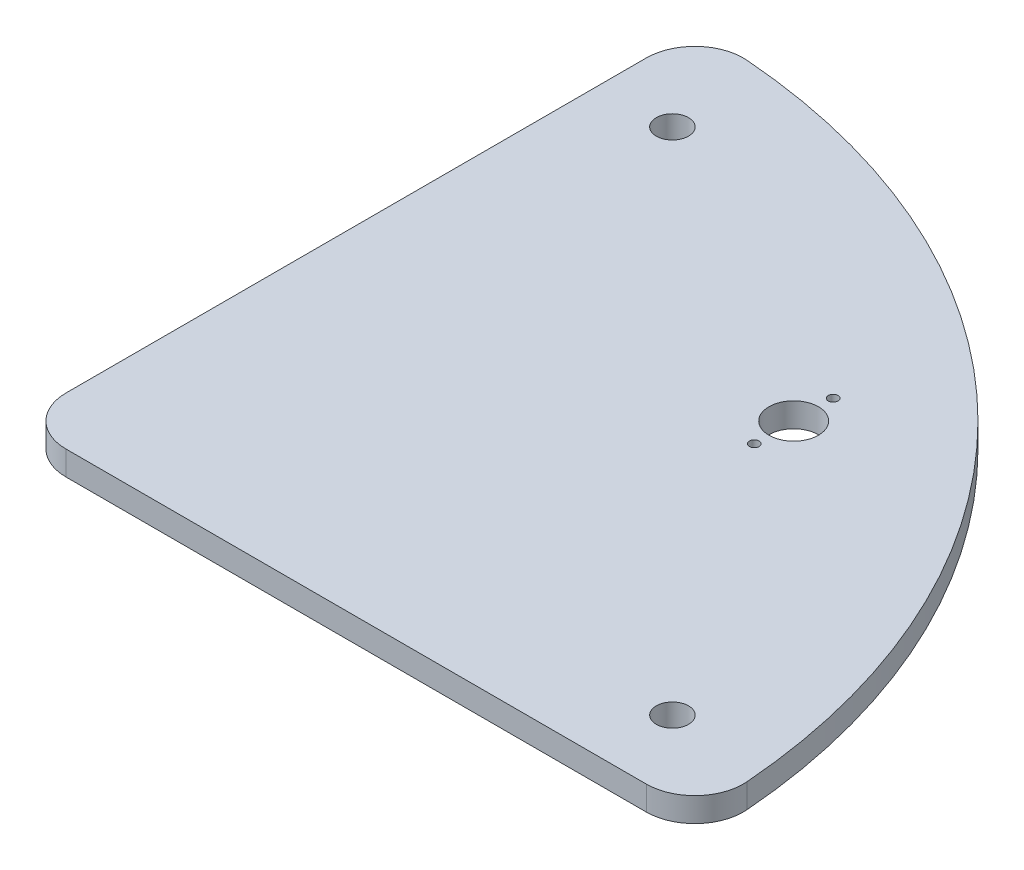
ISO-10303-21;
HEADER;
FILE_DESCRIPTION(('STEP AP214'),'2;1');
FILE_NAME('part.step','',(''),(''),'','','');
FILE_SCHEMA(('AUTOMOTIVE_DESIGN { 1 0 10303 214 1 1 1 1 }'));
ENDSEC;
DATA;
#1=APPLICATION_CONTEXT('core data for automotive mechanical design processes');
#2=APPLICATION_PROTOCOL_DEFINITION('international standard','automotive_design',2000,#1);
#3=PRODUCT_CONTEXT('',#1,'mechanical');
#4=PRODUCT('Part','Part','',(#3));
#5=PRODUCT_RELATED_PRODUCT_CATEGORY('part','',(#4));
#6=PRODUCT_DEFINITION_FORMATION('','',#4);
#7=PRODUCT_DEFINITION_CONTEXT('part definition',#1,'design');
#8=PRODUCT_DEFINITION('design','',#6,#7);
#9=PRODUCT_DEFINITION_SHAPE('','',#8);
#10=(LENGTH_UNIT() NAMED_UNIT(*) SI_UNIT(.MILLI.,.METRE.));
#11=(NAMED_UNIT(*) PLANE_ANGLE_UNIT() SI_UNIT($,.RADIAN.));
#12=(NAMED_UNIT(*) SI_UNIT($,.STERADIAN.) SOLID_ANGLE_UNIT());
#13=UNCERTAINTY_MEASURE_WITH_UNIT(LENGTH_MEASURE(1.E-05),#10,'distance_accuracy_value','');
#14=(GEOMETRIC_REPRESENTATION_CONTEXT(3) GLOBAL_UNCERTAINTY_ASSIGNED_CONTEXT((#13)) GLOBAL_UNIT_ASSIGNED_CONTEXT((#10,
#11,#12)) REPRESENTATION_CONTEXT('',''));
#15=CARTESIAN_POINT('',(0.,0.,0.));
#16=DIRECTION('',(0.,0.,1.));
#17=DIRECTION('',(1.,0.,0.));
#18=AXIS2_PLACEMENT_3D('',#15,#16,#17);
#19=CARTESIAN_POINT('',(0.,3.175,0.));
#20=DIRECTION('',(0.,0.,-1.));
#21=DIRECTION('',(-1.,0.,0.));
#22=AXIS2_PLACEMENT_3D('',#19,#20,#21);
#23=PLANE('',#22);
#24=DIRECTION('',(1.,0.,0.));
#25=VECTOR('',#24,1.);
#26=CARTESIAN_POINT('',(0.,-3.175,0.));
#27=LINE('',#26,#25);
#28=CARTESIAN_POINT('',(12.7,-3.175,0.));
#29=VERTEX_POINT('',#28);
#30=CARTESIAN_POINT('',(164.61081373956,-3.175,0.));
#31=VERTEX_POINT('',#30);
#32=EDGE_CURVE('E112',#29,#31,#27,.T.);
#33=ORIENTED_EDGE('',*,*,#32,.T.);
#34=DIRECTION('',(0.,-1.,0.));
#35=VECTOR('',#34,1.);
#36=CARTESIAN_POINT('',(164.61081373956,3.175,0.));
#37=LINE('',#36,#35);
#38=CARTESIAN_POINT('',(164.61081373956,3.175,0.));
#39=VERTEX_POINT('',#38);
#40=EDGE_CURVE('E91',#31,#39,#37,.F.);
#41=ORIENTED_EDGE('',*,*,#40,.T.);
#42=DIRECTION('',(1.,0.,0.));
#43=VECTOR('',#42,1.);
#44=CARTESIAN_POINT('',(0.,3.175,0.));
#45=LINE('',#44,#43);
#46=CARTESIAN_POINT('',(12.7,3.175,0.));
#47=VERTEX_POINT('',#46);
#48=EDGE_CURVE('E114',#47,#39,#45,.T.);
#49=ORIENTED_EDGE('',*,*,#48,.F.);
#50=DIRECTION('',(0.,-1.,0.));
#51=VECTOR('',#50,1.);
#52=CARTESIAN_POINT('',(12.7,3.175,0.));
#53=LINE('',#52,#51);
#54=EDGE_CURVE('E96',#47,#29,#53,.T.);
#55=ORIENTED_EDGE('',*,*,#54,.T.);
#56=EDGE_LOOP('',(#33,#41,#49,#55));
#57=FACE_BOUND('',#56,.T.);
#58=ADVANCED_FACE('F33',(#57),#23,.F.);
#59=CARTESIAN_POINT('',(0.,3.175,0.));
#60=DIRECTION('',(0.,-1.,0.));
#61=DIRECTION('',(0.,0.,-1.));
#62=AXIS2_PLACEMENT_3D('',#59,#60,#61);
#63=CYLINDRICAL_SURFACE('',#62,177.8);
#64=CARTESIAN_POINT('',(0.,3.175,0.));
#65=DIRECTION('',(0.,1.,0.));
#66=DIRECTION('',(0.,0.,-1.));
#67=AXIS2_PLACEMENT_3D('',#64,#65,#66);
#68=CIRCLE('',#67,177.8);
#69=CARTESIAN_POINT('',(177.273184027218,3.175,-13.6769230769231));
#70=VERTEX_POINT('',#69);
#71=CARTESIAN_POINT('',(13.6769230769231,3.175,-177.273184027218));
#72=VERTEX_POINT('',#71);
#73=EDGE_CURVE('E105',#70,#72,#68,.T.);
#74=ORIENTED_EDGE('',*,*,#73,.F.);
#75=DIRECTION('',(0.,-1.,0.));
#76=VECTOR('',#75,1.);
#77=CARTESIAN_POINT('',(177.273184027218,3.175,-13.6769230769231));
#78=LINE('',#77,#76);
#79=CARTESIAN_POINT('',(177.273184027218,-3.175,-13.6769230769231));
#80=VERTEX_POINT('',#79);
#81=EDGE_CURVE('E90',#70,#80,#78,.T.);
#82=ORIENTED_EDGE('',*,*,#81,.T.);
#83=CARTESIAN_POINT('',(0.,-3.175,0.));
#84=DIRECTION('',(0.,1.,0.));
#85=DIRECTION('',(0.,0.,-1.));
#86=AXIS2_PLACEMENT_3D('',#83,#84,#85);
#87=CIRCLE('',#86,177.8);
#88=CARTESIAN_POINT('',(13.6769230769231,-3.175,-177.273184027218));
#89=VERTEX_POINT('',#88);
#90=EDGE_CURVE('E103',#80,#89,#87,.T.);
#91=ORIENTED_EDGE('',*,*,#90,.T.);
#92=DIRECTION('',(0.,-1.,0.));
#93=VECTOR('',#92,1.);
#94=CARTESIAN_POINT('',(13.6769230769231,3.175,-177.273184027218));
#95=LINE('',#94,#93);
#96=EDGE_CURVE('E107',#89,#72,#95,.F.);
#97=ORIENTED_EDGE('',*,*,#96,.T.);
#98=EDGE_LOOP('',(#74,#82,#91,#97));
#99=FACE_BOUND('',#98,.T.);
#100=ADVANCED_FACE('F102',(#99),#63,.T.);
#101=CARTESIAN_POINT('',(0.,3.175,-177.8));
#102=DIRECTION('',(1.,0.,0.));
#103=DIRECTION('',(0.,0.,-1.));
#104=AXIS2_PLACEMENT_3D('',#101,#102,#103);
#105=PLANE('',#104);
#106=DIRECTION('',(0.,0.,1.));
#107=VECTOR('',#106,1.);
#108=CARTESIAN_POINT('',(0.,-3.175,-177.8));
#109=LINE('',#108,#107);
#110=CARTESIAN_POINT('',(0.,-3.175,-164.61081373956));
#111=VERTEX_POINT('',#110);
#112=CARTESIAN_POINT('',(0.,-3.175,-12.7));
#113=VERTEX_POINT('',#112);
#114=EDGE_CURVE('E111',#111,#113,#109,.T.);
#115=ORIENTED_EDGE('',*,*,#114,.T.);
#116=DIRECTION('',(0.,-1.,0.));
#117=VECTOR('',#116,1.);
#118=CARTESIAN_POINT('',(0.,3.175,-12.7));
#119=LINE('',#118,#117);
#120=CARTESIAN_POINT('',(0.,3.175,-12.7));
#121=VERTEX_POINT('',#120);
#122=EDGE_CURVE('E11',#113,#121,#119,.F.);
#123=ORIENTED_EDGE('',*,*,#122,.T.);
#124=DIRECTION('',(0.,0.,1.));
#125=VECTOR('',#124,1.);
#126=CARTESIAN_POINT('',(0.,3.175,-177.8));
#127=LINE('',#126,#125);
#128=CARTESIAN_POINT('',(0.,3.175,-164.61081373956));
#129=VERTEX_POINT('',#128);
#130=EDGE_CURVE('E120',#129,#121,#127,.T.);
#131=ORIENTED_EDGE('',*,*,#130,.F.);
#132=DIRECTION('',(0.,-1.,0.));
#133=VECTOR('',#132,1.);
#134=CARTESIAN_POINT('',(0.,3.175,-164.61081373956));
#135=LINE('',#134,#133);
#136=EDGE_CURVE('E41',#129,#111,#135,.T.);
#137=ORIENTED_EDGE('',*,*,#136,.T.);
#138=EDGE_LOOP('',(#115,#123,#131,#137));
#139=FACE_BOUND('',#138,.T.);
#140=ADVANCED_FACE('F133',(#139),#105,.F.);
#141=CARTESIAN_POINT('',(0.,3.175,0.));
#142=DIRECTION('',(0.,-1.,0.));
#143=DIRECTION('',(0.,0.,-1.));
#144=AXIS2_PLACEMENT_3D('',#141,#142,#143);
#145=PLANE('',#144);
#146=CARTESIAN_POINT('',(19.05,3.175,-152.4));
#147=DIRECTION('',(0.,1.,0.));
#148=DIRECTION('',(0.,0.,1.));
#149=AXIS2_PLACEMENT_3D('',#146,#147,#148);
#150=CIRCLE('',#149,4.21639999999999);
#151=CARTESIAN_POINT('',(19.05,3.175,-148.1836));
#152=VERTEX_POINT('',#151);
#153=EDGE_CURVE('E298',#152,#152,#150,.T.);
#154=ORIENTED_EDGE('',*,*,#153,.F.);
#155=EDGE_LOOP('',(#154));
#156=FACE_BOUND('',#155,.T.);
#157=CARTESIAN_POINT('',(152.4,3.175,-19.05));
#158=DIRECTION('',(0.,1.,0.));
#159=DIRECTION('',(0.,0.,1.));
#160=AXIS2_PLACEMENT_3D('',#157,#158,#159);
#161=CIRCLE('',#160,4.21639999999998);
#162=CARTESIAN_POINT('',(152.4,3.175,-14.8336000000001));
#163=VERTEX_POINT('',#162);
#164=EDGE_CURVE('E290',#163,#163,#161,.T.);
#165=ORIENTED_EDGE('',*,*,#164,.F.);
#166=EDGE_LOOP('',(#165));
#167=FACE_BOUND('',#166,.T.);
#168=CARTESIAN_POINT('',(101.6,3.175,-91.2749));
#169=DIRECTION('',(0.,1.,0.));
#170=DIRECTION('',(0.,0.,1.));
#171=AXIS2_PLACEMENT_3D('',#168,#169,#170);
#172=CIRCLE('',#171,1.26999999999999);
#173=CARTESIAN_POINT('',(101.6,3.175,-90.0049));
#174=VERTEX_POINT('',#173);
#175=EDGE_CURVE('E272',#174,#174,#172,.T.);
#176=ORIENTED_EDGE('',*,*,#175,.F.);
#177=EDGE_LOOP('',(#176));
#178=FACE_BOUND('',#177,.T.);
#179=CARTESIAN_POINT('',(101.6,3.175,-111.9251));
#180=DIRECTION('',(0.,1.,0.));
#181=DIRECTION('',(0.,0.,1.));
#182=AXIS2_PLACEMENT_3D('',#179,#180,#181);
#183=CIRCLE('',#182,1.26999999999999);
#184=CARTESIAN_POINT('',(101.6,3.175,-110.6551));
#185=VERTEX_POINT('',#184);
#186=EDGE_CURVE('E285',#185,#185,#183,.T.);
#187=ORIENTED_EDGE('',*,*,#186,.F.);
#188=EDGE_LOOP('',(#187));
#189=FACE_BOUND('',#188,.T.);
#190=CARTESIAN_POINT('',(101.6,3.175,-101.6));
#191=DIRECTION('',(0.,1.,0.));
#192=DIRECTION('',(0.,0.,1.));
#193=AXIS2_PLACEMENT_3D('',#190,#191,#192);
#194=CIRCLE('',#193,6.477);
#195=CARTESIAN_POINT('',(101.6,3.175,-95.123));
#196=VERTEX_POINT('',#195);
#197=EDGE_CURVE('E145',#196,#196,#194,.T.);
#198=ORIENTED_EDGE('',*,*,#197,.F.);
#199=EDGE_LOOP('',(#198));
#200=FACE_BOUND('',#199,.T.);
#201=ORIENTED_EDGE('',*,*,#48,.T.);
#202=CARTESIAN_POINT('',(164.61081373956,3.175,-12.7));
#203=DIRECTION('',(0.,-1.,0.));
#204=DIRECTION('',(0.,0.,-1.));
#205=AXIS2_PLACEMENT_3D('',#202,#203,#204);
#206=CIRCLE('',#205,12.7);
#207=EDGE_CURVE('E130',#39,#70,#206,.F.);
#208=ORIENTED_EDGE('',*,*,#207,.T.);
#209=ORIENTED_EDGE('',*,*,#73,.T.);
#210=CARTESIAN_POINT('',(12.7,3.175,-164.61081373956));
#211=DIRECTION('',(0.,-1.,0.));
#212=DIRECTION('',(0.,0.,-1.));
#213=AXIS2_PLACEMENT_3D('',#210,#211,#212);
#214=CIRCLE('',#213,12.7);
#215=EDGE_CURVE('E53',#72,#129,#214,.F.);
#216=ORIENTED_EDGE('',*,*,#215,.T.);
#217=ORIENTED_EDGE('',*,*,#130,.T.);
#218=CARTESIAN_POINT('',(12.7,3.175,-12.7));
#219=DIRECTION('',(0.,-1.,0.));
#220=DIRECTION('',(0.,0.,-1.));
#221=AXIS2_PLACEMENT_3D('',#218,#219,#220);
#222=CIRCLE('',#221,12.7);
#223=EDGE_CURVE('E128',#121,#47,#222,.F.);
#224=ORIENTED_EDGE('',*,*,#223,.T.);
#225=EDGE_LOOP('',(#201,#208,#209,#216,#217,#224));
#226=FACE_BOUND('',#225,.T.);
#227=ADVANCED_FACE('F147',(#156,#167,#178,#189,#200,#226),#145,.F.);
#228=CARTESIAN_POINT('',(0.,-3.175,0.));
#229=DIRECTION('',(0.,-1.,0.));
#230=DIRECTION('',(0.,0.,-1.));
#231=AXIS2_PLACEMENT_3D('',#228,#229,#230);
#232=PLANE('',#231);
#233=CARTESIAN_POINT('',(19.05,-3.17499999999999,-152.4));
#234=DIRECTION('',(0.,1.,0.));
#235=DIRECTION('',(0.,0.,1.));
#236=AXIS2_PLACEMENT_3D('',#233,#234,#235);
#237=CIRCLE('',#236,4.21639999999999);
#238=CARTESIAN_POINT('',(19.05,-3.17499999999999,-148.1836));
#239=VERTEX_POINT('',#238);
#240=EDGE_CURVE('E294',#239,#239,#237,.T.);
#241=ORIENTED_EDGE('',*,*,#240,.T.);
#242=EDGE_LOOP('',(#241));
#243=FACE_BOUND('',#242,.T.);
#244=CARTESIAN_POINT('',(152.4,-3.17499999999999,-19.05));
#245=DIRECTION('',(0.,1.,0.));
#246=DIRECTION('',(0.,0.,1.));
#247=AXIS2_PLACEMENT_3D('',#244,#245,#246);
#248=CIRCLE('',#247,4.21639999999998);
#249=CARTESIAN_POINT('',(152.4,-3.17499999999999,-14.8336000000001));
#250=VERTEX_POINT('',#249);
#251=EDGE_CURVE('E280',#250,#250,#248,.T.);
#252=ORIENTED_EDGE('',*,*,#251,.T.);
#253=EDGE_LOOP('',(#252));
#254=FACE_BOUND('',#253,.T.);
#255=CARTESIAN_POINT('',(101.6,-3.175,-91.2749));
#256=DIRECTION('',(0.,1.,0.));
#257=DIRECTION('',(0.,0.,1.));
#258=AXIS2_PLACEMENT_3D('',#255,#256,#257);
#259=CIRCLE('',#258,1.26999999999999);
#260=CARTESIAN_POINT('',(101.6,-3.175,-90.0049));
#261=VERTEX_POINT('',#260);
#262=EDGE_CURVE('E270',#261,#261,#259,.T.);
#263=ORIENTED_EDGE('',*,*,#262,.T.);
#264=EDGE_LOOP('',(#263));
#265=FACE_BOUND('',#264,.T.);
#266=CARTESIAN_POINT('',(101.6,-3.175,-111.9251));
#267=DIRECTION('',(0.,1.,0.));
#268=DIRECTION('',(0.,0.,1.));
#269=AXIS2_PLACEMENT_3D('',#266,#267,#268);
#270=CIRCLE('',#269,1.26999999999999);
#271=CARTESIAN_POINT('',(101.6,-3.175,-110.6551));
#272=VERTEX_POINT('',#271);
#273=EDGE_CURVE('E277',#272,#272,#270,.T.);
#274=ORIENTED_EDGE('',*,*,#273,.T.);
#275=EDGE_LOOP('',(#274));
#276=FACE_BOUND('',#275,.T.);
#277=CARTESIAN_POINT('',(101.6,-3.175,-101.6));
#278=DIRECTION('',(0.,1.,0.));
#279=DIRECTION('',(0.,0.,1.));
#280=AXIS2_PLACEMENT_3D('',#277,#278,#279);
#281=CIRCLE('',#280,6.477);
#282=CARTESIAN_POINT('',(101.6,-3.175,-95.123));
#283=VERTEX_POINT('',#282);
#284=EDGE_CURVE('E116',#283,#283,#281,.T.);
#285=ORIENTED_EDGE('',*,*,#284,.T.);
#286=EDGE_LOOP('',(#285));
#287=FACE_BOUND('',#286,.T.);
#288=ORIENTED_EDGE('',*,*,#90,.F.);
#289=CARTESIAN_POINT('',(164.61081373956,-3.175,-12.7));
#290=DIRECTION('',(0.,-1.,0.));
#291=DIRECTION('',(0.,0.,-1.));
#292=AXIS2_PLACEMENT_3D('',#289,#290,#291);
#293=CIRCLE('',#292,12.7);
#294=EDGE_CURVE('E86',#80,#31,#293,.T.);
#295=ORIENTED_EDGE('',*,*,#294,.T.);
#296=ORIENTED_EDGE('',*,*,#32,.F.);
#297=CARTESIAN_POINT('',(12.7,-3.175,-12.7));
#298=DIRECTION('',(0.,-1.,0.));
#299=DIRECTION('',(0.,0.,-1.));
#300=AXIS2_PLACEMENT_3D('',#297,#298,#299);
#301=CIRCLE('',#300,12.7);
#302=EDGE_CURVE('E97',#29,#113,#301,.T.);
#303=ORIENTED_EDGE('',*,*,#302,.T.);
#304=ORIENTED_EDGE('',*,*,#114,.F.);
#305=CARTESIAN_POINT('',(12.7,-3.175,-164.61081373956));
#306=DIRECTION('',(0.,-1.,0.));
#307=DIRECTION('',(0.,0.,-1.));
#308=AXIS2_PLACEMENT_3D('',#305,#306,#307);
#309=CIRCLE('',#308,12.7);
#310=EDGE_CURVE('E106',#111,#89,#309,.T.);
#311=ORIENTED_EDGE('',*,*,#310,.T.);
#312=EDGE_LOOP('',(#288,#295,#296,#303,#304,#311));
#313=FACE_BOUND('',#312,.T.);
#314=ADVANCED_FACE('F109',(#243,#254,#265,#276,#287,#313),#232,.T.);
#315=CARTESIAN_POINT('',(101.6,-3.175,-101.6));
#316=DIRECTION('',(0.,1.,0.));
#317=DIRECTION('',(0.,0.,1.));
#318=AXIS2_PLACEMENT_3D('',#315,#316,#317);
#319=CYLINDRICAL_SURFACE('',#318,6.477);
#320=ORIENTED_EDGE('',*,*,#284,.F.);
#321=EDGE_LOOP('',(#320));
#322=FACE_BOUND('',#321,.T.);
#323=ORIENTED_EDGE('',*,*,#197,.T.);
#324=EDGE_LOOP('',(#323));
#325=FACE_BOUND('',#324,.T.);
#326=ADVANCED_FACE('F155',(#322,#325),#319,.F.);
#327=CARTESIAN_POINT('',(101.6,-3.175,-111.9251));
#328=DIRECTION('',(0.,1.,0.));
#329=DIRECTION('',(0.,0.,1.));
#330=AXIS2_PLACEMENT_3D('',#327,#328,#329);
#331=CYLINDRICAL_SURFACE('',#330,1.26999999999999);
#332=ORIENTED_EDGE('',*,*,#273,.F.);
#333=EDGE_LOOP('',(#332));
#334=FACE_BOUND('',#333,.T.);
#335=ORIENTED_EDGE('',*,*,#186,.T.);
#336=EDGE_LOOP('',(#335));
#337=FACE_BOUND('',#336,.T.);
#338=ADVANCED_FACE('F244',(#334,#337),#331,.F.);
#339=CARTESIAN_POINT('',(101.6,-3.175,-91.2749));
#340=DIRECTION('',(0.,1.,0.));
#341=DIRECTION('',(0.,0.,1.));
#342=AXIS2_PLACEMENT_3D('',#339,#340,#341);
#343=CYLINDRICAL_SURFACE('',#342,1.26999999999999);
#344=ORIENTED_EDGE('',*,*,#262,.F.);
#345=EDGE_LOOP('',(#344));
#346=FACE_BOUND('',#345,.T.);
#347=ORIENTED_EDGE('',*,*,#175,.T.);
#348=EDGE_LOOP('',(#347));
#349=FACE_BOUND('',#348,.T.);
#350=ADVANCED_FACE('F234',(#346,#349),#343,.F.);
#351=CARTESIAN_POINT('',(152.4,3.175,-19.05));
#352=DIRECTION('',(0.,1.,0.));
#353=DIRECTION('',(0.,0.,1.));
#354=AXIS2_PLACEMENT_3D('',#351,#352,#353);
#355=CYLINDRICAL_SURFACE('',#354,4.21639999999998);
#356=ORIENTED_EDGE('',*,*,#251,.F.);
#357=EDGE_LOOP('',(#356));
#358=FACE_BOUND('',#357,.T.);
#359=ORIENTED_EDGE('',*,*,#164,.T.);
#360=EDGE_LOOP('',(#359));
#361=FACE_BOUND('',#360,.T.);
#362=ADVANCED_FACE('F224',(#358,#361),#355,.F.);
#363=CARTESIAN_POINT('',(19.05,3.175,-152.4));
#364=DIRECTION('',(0.,1.,0.));
#365=DIRECTION('',(0.,0.,1.));
#366=AXIS2_PLACEMENT_3D('',#363,#364,#365);
#367=CYLINDRICAL_SURFACE('',#366,4.21639999999999);
#368=ORIENTED_EDGE('',*,*,#240,.F.);
#369=EDGE_LOOP('',(#368));
#370=FACE_BOUND('',#369,.T.);
#371=ORIENTED_EDGE('',*,*,#153,.T.);
#372=EDGE_LOOP('',(#371));
#373=FACE_BOUND('',#372,.T.);
#374=ADVANCED_FACE('F170',(#370,#373),#367,.F.);
#375=CARTESIAN_POINT('',(164.61081373956,3.175,-12.7));
#376=DIRECTION('',(0.,-1.,0.));
#377=DIRECTION('',(0.,0.,-1.));
#378=AXIS2_PLACEMENT_3D('',#375,#376,#377);
#379=CYLINDRICAL_SURFACE('',#378,12.7);
#380=ORIENTED_EDGE('',*,*,#207,.F.);
#381=ORIENTED_EDGE('',*,*,#40,.F.);
#382=ORIENTED_EDGE('',*,*,#294,.F.);
#383=ORIENTED_EDGE('',*,*,#81,.F.);
#384=EDGE_LOOP('',(#380,#381,#382,#383));
#385=FACE_BOUND('',#384,.T.);
#386=ADVANCED_FACE('F89',(#385),#379,.T.);
#387=CARTESIAN_POINT('',(12.7,3.175,-12.7));
#388=DIRECTION('',(0.,-1.,0.));
#389=DIRECTION('',(0.,0.,-1.));
#390=AXIS2_PLACEMENT_3D('',#387,#388,#389);
#391=CYLINDRICAL_SURFACE('',#390,12.7);
#392=ORIENTED_EDGE('',*,*,#223,.F.);
#393=ORIENTED_EDGE('',*,*,#122,.F.);
#394=ORIENTED_EDGE('',*,*,#302,.F.);
#395=ORIENTED_EDGE('',*,*,#54,.F.);
#396=EDGE_LOOP('',(#392,#393,#394,#395));
#397=FACE_BOUND('',#396,.T.);
#398=ADVANCED_FACE('F138',(#397),#391,.T.);
#399=CARTESIAN_POINT('',(12.7,3.175,-164.61081373956));
#400=DIRECTION('',(0.,-1.,0.));
#401=DIRECTION('',(0.,0.,-1.));
#402=AXIS2_PLACEMENT_3D('',#399,#400,#401);
#403=CYLINDRICAL_SURFACE('',#402,12.7);
#404=ORIENTED_EDGE('',*,*,#215,.F.);
#405=ORIENTED_EDGE('',*,*,#96,.F.);
#406=ORIENTED_EDGE('',*,*,#310,.F.);
#407=ORIENTED_EDGE('',*,*,#136,.F.);
#408=EDGE_LOOP('',(#404,#405,#406,#407));
#409=FACE_BOUND('',#408,.T.);
#410=ADVANCED_FACE('F35',(#409),#403,.T.);
#411=CLOSED_SHELL('',(#58,#100,#140,#227,#314,#326,#338,#350,#362,#374,#386,#398,#410));
#412=MANIFOLD_SOLID_BREP('B2',#411);
#413=ADVANCED_BREP_SHAPE_REPRESENTATION('',(#18,#412),#14);
#414=SHAPE_DEFINITION_REPRESENTATION(#9,#413);
ENDSEC;
END-ISO-10303-21;
